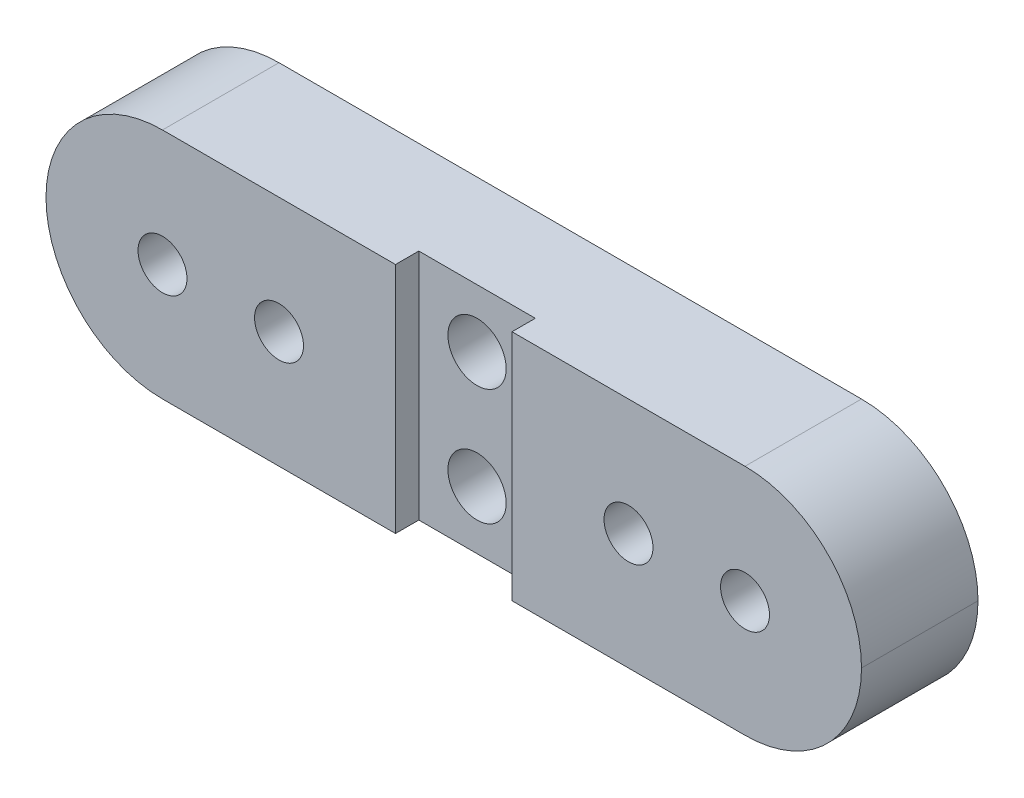
ISO-10303-21;
HEADER;
FILE_DESCRIPTION(('STEP AP214'),'2;1');
FILE_NAME('part.step','',(''),(''),'','','');
FILE_SCHEMA(('AUTOMOTIVE_DESIGN { 1 0 10303 214 1 1 1 1 }'));
ENDSEC;
DATA;
#1=APPLICATION_CONTEXT('core data for automotive mechanical design processes');
#2=APPLICATION_PROTOCOL_DEFINITION('international standard','automotive_design',2000,#1);
#3=PRODUCT_CONTEXT('',#1,'mechanical');
#4=PRODUCT('Part','Part','',(#3));
#5=PRODUCT_RELATED_PRODUCT_CATEGORY('part','',(#4));
#6=PRODUCT_DEFINITION_FORMATION('','',#4);
#7=PRODUCT_DEFINITION_CONTEXT('part definition',#1,'design');
#8=PRODUCT_DEFINITION('design','',#6,#7);
#9=PRODUCT_DEFINITION_SHAPE('','',#8);
#10=(LENGTH_UNIT() NAMED_UNIT(*) SI_UNIT(.MILLI.,.METRE.));
#11=(NAMED_UNIT(*) PLANE_ANGLE_UNIT() SI_UNIT($,.RADIAN.));
#12=(NAMED_UNIT(*) SI_UNIT($,.STERADIAN.) SOLID_ANGLE_UNIT());
#13=UNCERTAINTY_MEASURE_WITH_UNIT(LENGTH_MEASURE(1.E-05),#10,'distance_accuracy_value','');
#14=(GEOMETRIC_REPRESENTATION_CONTEXT(3) GLOBAL_UNCERTAINTY_ASSIGNED_CONTEXT((#13)) GLOBAL_UNIT_ASSIGNED_CONTEXT((#10,
#11,#12)) REPRESENTATION_CONTEXT('',''));
#15=CARTESIAN_POINT('',(0.,0.,0.));
#16=DIRECTION('',(0.,0.,1.));
#17=DIRECTION('',(1.,0.,0.));
#18=AXIS2_PLACEMENT_3D('',#15,#16,#17);
#19=CARTESIAN_POINT('',(0.,0.,10.));
#20=DIRECTION('',(0.,0.,1.));
#21=DIRECTION('',(1.,0.,0.));
#22=AXIS2_PLACEMENT_3D('',#19,#20,#21);
#23=PLANE('',#22);
#24=DIRECTION('',(0.,1.,0.));
#25=VECTOR('',#24,1.);
#26=CARTESIAN_POINT('',(40.,20.,10.));
#27=LINE('',#26,#25);
#28=CARTESIAN_POINT('',(40.,0.,10.));
#29=VERTEX_POINT('',#28);
#30=CARTESIAN_POINT('',(40.,20.,10.));
#31=VERTEX_POINT('',#30);
#32=EDGE_CURVE('E135',#29,#31,#27,.T.);
#33=ORIENTED_EDGE('',*,*,#32,.F.);
#34=DIRECTION('',(1.,0.,0.));
#35=VECTOR('',#34,1.);
#36=CARTESIAN_POINT('',(0.,0.,10.));
#37=LINE('',#36,#35);
#38=CARTESIAN_POINT('',(60.,0.,10.));
#39=VERTEX_POINT('',#38);
#40=EDGE_CURVE('E175',#29,#39,#37,.T.);
#41=ORIENTED_EDGE('',*,*,#40,.T.);
#42=CARTESIAN_POINT('',(60.,10.,10.));
#43=DIRECTION('',(0.,0.,1.));
#44=DIRECTION('',(1.,0.,0.));
#45=AXIS2_PLACEMENT_3D('',#42,#43,#44);
#46=CIRCLE('',#45,10.);
#47=CARTESIAN_POINT('',(70.,10.,10.));
#48=VERTEX_POINT('',#47);
#49=EDGE_CURVE('E208',#39,#48,#46,.T.);
#50=ORIENTED_EDGE('',*,*,#49,.T.);
#51=CARTESIAN_POINT('',(60.,10.,10.));
#52=DIRECTION('',(0.,0.,1.));
#53=DIRECTION('',(1.,0.,0.));
#54=AXIS2_PLACEMENT_3D('',#51,#52,#53);
#55=CIRCLE('',#54,10.);
#56=CARTESIAN_POINT('',(60.,20.,10.));
#57=VERTEX_POINT('',#56);
#58=EDGE_CURVE('E206',#48,#57,#55,.T.);
#59=ORIENTED_EDGE('',*,*,#58,.T.);
#60=DIRECTION('',(-1.,0.,0.));
#61=VECTOR('',#60,1.);
#62=CARTESIAN_POINT('',(0.,20.,10.));
#63=LINE('',#62,#61);
#64=EDGE_CURVE('E176',#57,#31,#63,.T.);
#65=ORIENTED_EDGE('',*,*,#64,.T.);
#66=EDGE_LOOP('',(#33,#41,#50,#59,#65));
#67=FACE_BOUND('',#66,.T.);
#68=CARTESIAN_POINT('',(60.,10.,10.));
#69=DIRECTION('',(0.,0.,1.));
#70=DIRECTION('',(1.,0.,0.));
#71=AXIS2_PLACEMENT_3D('',#68,#69,#70);
#72=CIRCLE('',#71,2.09999999999998);
#73=CARTESIAN_POINT('',(62.1,10.,10.));
#74=VERTEX_POINT('',#73);
#75=EDGE_CURVE('E153',#74,#74,#72,.T.);
#76=ORIENTED_EDGE('',*,*,#75,.F.);
#77=EDGE_LOOP('',(#76));
#78=FACE_BOUND('',#77,.T.);
#79=CARTESIAN_POINT('',(50.,10.,10.));
#80=DIRECTION('',(0.,0.,1.));
#81=DIRECTION('',(1.,0.,0.));
#82=AXIS2_PLACEMENT_3D('',#79,#80,#81);
#83=CIRCLE('',#82,2.09999999999999);
#84=CARTESIAN_POINT('',(52.1,10.,10.));
#85=VERTEX_POINT('',#84);
#86=EDGE_CURVE('E147',#85,#85,#83,.T.);
#87=ORIENTED_EDGE('',*,*,#86,.F.);
#88=EDGE_LOOP('',(#87));
#89=FACE_BOUND('',#88,.T.);
#90=ADVANCED_FACE('F41',(#67,#78,#89),#23,.T.);
#91=CARTESIAN_POINT('',(0.,0.,10.));
#92=DIRECTION('',(0.,1.,0.));
#93=DIRECTION('',(-1.,0.,0.));
#94=AXIS2_PLACEMENT_3D('',#91,#92,#93);
#95=PLANE('',#94);
#96=ORIENTED_EDGE('',*,*,#40,.F.);
#97=DIRECTION('',(0.,0.,1.));
#98=VECTOR('',#97,1.);
#99=CARTESIAN_POINT('',(40.,0.,8.));
#100=LINE('',#99,#98);
#101=CARTESIAN_POINT('',(40.,0.,8.));
#102=VERTEX_POINT('',#101);
#103=EDGE_CURVE('E139',#102,#29,#100,.T.);
#104=ORIENTED_EDGE('',*,*,#103,.F.);
#105=DIRECTION('',(1.,0.,0.));
#106=VECTOR('',#105,1.);
#107=CARTESIAN_POINT('',(40.,0.,8.));
#108=LINE('',#107,#106);
#109=CARTESIAN_POINT('',(30.,0.,8.));
#110=VERTEX_POINT('',#109);
#111=EDGE_CURVE('E124',#110,#102,#108,.T.);
#112=ORIENTED_EDGE('',*,*,#111,.F.);
#113=DIRECTION('',(0.,0.,1.));
#114=VECTOR('',#113,1.);
#115=CARTESIAN_POINT('',(30.,0.,8.));
#116=LINE('',#115,#114);
#117=CARTESIAN_POINT('',(30.,0.,10.));
#118=VERTEX_POINT('',#117);
#119=EDGE_CURVE('E121',#110,#118,#116,.T.);
#120=ORIENTED_EDGE('',*,*,#119,.T.);
#121=CARTESIAN_POINT('',(10.,0.,10.));
#122=VERTEX_POINT('',#121);
#123=EDGE_CURVE('E172',#122,#118,#37,.T.);
#124=ORIENTED_EDGE('',*,*,#123,.F.);
#125=DIRECTION('',(0.,0.,-1.));
#126=VECTOR('',#125,1.);
#127=CARTESIAN_POINT('',(10.,0.,10.));
#128=LINE('',#127,#126);
#129=CARTESIAN_POINT('',(10.,0.,0.));
#130=VERTEX_POINT('',#129);
#131=EDGE_CURVE('E195',#122,#130,#128,.T.);
#132=ORIENTED_EDGE('',*,*,#131,.T.);
#133=DIRECTION('',(1.,0.,0.));
#134=VECTOR('',#133,1.);
#135=CARTESIAN_POINT('',(0.,0.,0.));
#136=LINE('',#135,#134);
#137=CARTESIAN_POINT('',(60.,0.,0.));
#138=VERTEX_POINT('',#137);
#139=EDGE_CURVE('E180',#130,#138,#136,.T.);
#140=ORIENTED_EDGE('',*,*,#139,.T.);
#141=DIRECTION('',(0.,0.,-1.));
#142=VECTOR('',#141,1.);
#143=CARTESIAN_POINT('',(60.,0.,10.));
#144=LINE('',#143,#142);
#145=EDGE_CURVE('E179',#138,#39,#144,.F.);
#146=ORIENTED_EDGE('',*,*,#145,.T.);
#147=EDGE_LOOP('',(#96,#104,#112,#120,#124,#132,#140,#146));
#148=FACE_BOUND('',#147,.T.);
#149=ADVANCED_FACE('F244',(#148),#95,.F.);
#150=CARTESIAN_POINT('',(35.,15.,10.));
#151=DIRECTION('',(0.,0.,-1.));
#152=DIRECTION('',(-1.,0.,0.));
#153=AXIS2_PLACEMENT_3D('',#150,#151,#152);
#154=CYLINDRICAL_SURFACE('',#153,2.49999999999999);
#155=CARTESIAN_POINT('',(35.,15.,8.));
#156=DIRECTION('',(0.,0.,-1.));
#157=DIRECTION('',(-1.,0.,0.));
#158=AXIS2_PLACEMENT_3D('',#155,#156,#157);
#159=CIRCLE('',#158,2.49999999999999);
#160=CARTESIAN_POINT('',(32.5,15.,8.));
#161=VERTEX_POINT('',#160);
#162=EDGE_CURVE('E144',#161,#161,#159,.T.);
#163=ORIENTED_EDGE('',*,*,#162,.F.);
#164=EDGE_LOOP('',(#163));
#165=FACE_BOUND('',#164,.T.);
#166=CARTESIAN_POINT('',(35.,15.,0.));
#167=DIRECTION('',(0.,0.,1.));
#168=DIRECTION('',(1.,0.,0.));
#169=AXIS2_PLACEMENT_3D('',#166,#167,#168);
#170=CIRCLE('',#169,2.49999999999999);
#171=CARTESIAN_POINT('',(37.5,15.,0.));
#172=VERTEX_POINT('',#171);
#173=EDGE_CURVE('E187',#172,#172,#170,.T.);
#174=ORIENTED_EDGE('',*,*,#173,.F.);
#175=EDGE_LOOP('',(#174));
#176=FACE_BOUND('',#175,.T.);
#177=ADVANCED_FACE('F275',(#165,#176),#154,.F.);
#178=CARTESIAN_POINT('',(0.,20.,10.));
#179=DIRECTION('',(0.,-1.,0.));
#180=DIRECTION('',(1.,0.,0.));
#181=AXIS2_PLACEMENT_3D('',#178,#179,#180);
#182=PLANE('',#181);
#183=DIRECTION('',(-1.,0.,0.));
#184=VECTOR('',#183,1.);
#185=CARTESIAN_POINT('',(30.,20.,8.));
#186=LINE('',#185,#184);
#187=CARTESIAN_POINT('',(40.,20.,8.));
#188=VERTEX_POINT('',#187);
#189=CARTESIAN_POINT('',(30.,20.,8.));
#190=VERTEX_POINT('',#189);
#191=EDGE_CURVE('E125',#188,#190,#186,.T.);
#192=ORIENTED_EDGE('',*,*,#191,.F.);
#193=DIRECTION('',(0.,0.,1.));
#194=VECTOR('',#193,1.);
#195=CARTESIAN_POINT('',(40.,20.,8.));
#196=LINE('',#195,#194);
#197=EDGE_CURVE('E232',#188,#31,#196,.T.);
#198=ORIENTED_EDGE('',*,*,#197,.T.);
#199=ORIENTED_EDGE('',*,*,#64,.F.);
#200=DIRECTION('',(0.,0.,-1.));
#201=VECTOR('',#200,1.);
#202=CARTESIAN_POINT('',(60.,20.,0.));
#203=LINE('',#202,#201);
#204=CARTESIAN_POINT('',(60.,20.,0.));
#205=VERTEX_POINT('',#204);
#206=EDGE_CURVE('E50',#57,#205,#203,.T.);
#207=ORIENTED_EDGE('',*,*,#206,.T.);
#208=DIRECTION('',(-1.,0.,0.));
#209=VECTOR('',#208,1.);
#210=CARTESIAN_POINT('',(0.,20.,0.));
#211=LINE('',#210,#209);
#212=CARTESIAN_POINT('',(10.,20.,0.));
#213=VERTEX_POINT('',#212);
#214=EDGE_CURVE('E183',#205,#213,#211,.T.);
#215=ORIENTED_EDGE('',*,*,#214,.T.);
#216=DIRECTION('',(0.,0.,-1.));
#217=VECTOR('',#216,1.);
#218=CARTESIAN_POINT('',(10.,20.,10.));
#219=LINE('',#218,#217);
#220=CARTESIAN_POINT('',(10.,20.,10.));
#221=VERTEX_POINT('',#220);
#222=EDGE_CURVE('E11',#213,#221,#219,.F.);
#223=ORIENTED_EDGE('',*,*,#222,.T.);
#224=CARTESIAN_POINT('',(30.,20.,10.));
#225=VERTEX_POINT('',#224);
#226=EDGE_CURVE('E65',#225,#221,#63,.T.);
#227=ORIENTED_EDGE('',*,*,#226,.F.);
#228=DIRECTION('',(0.,0.,1.));
#229=VECTOR('',#228,1.);
#230=CARTESIAN_POINT('',(30.,20.,8.));
#231=LINE('',#230,#229);
#232=EDGE_CURVE('E58',#190,#225,#231,.T.);
#233=ORIENTED_EDGE('',*,*,#232,.F.);
#234=EDGE_LOOP('',(#192,#198,#199,#207,#215,#223,#227,#233));
#235=FACE_BOUND('',#234,.T.);
#236=ADVANCED_FACE('F137',(#235),#182,.F.);
#237=CARTESIAN_POINT('',(35.,5.,10.));
#238=DIRECTION('',(0.,0.,-1.));
#239=DIRECTION('',(-1.,0.,0.));
#240=AXIS2_PLACEMENT_3D('',#237,#238,#239);
#241=CYLINDRICAL_SURFACE('',#240,2.49999999999999);
#242=CARTESIAN_POINT('',(35.,5.,8.));
#243=DIRECTION('',(0.,0.,-1.));
#244=DIRECTION('',(-1.,0.,0.));
#245=AXIS2_PLACEMENT_3D('',#242,#243,#244);
#246=CIRCLE('',#245,2.49999999999999);
#247=CARTESIAN_POINT('',(32.5,5.,8.));
#248=VERTEX_POINT('',#247);
#249=EDGE_CURVE('E45',#248,#248,#246,.F.);
#250=ORIENTED_EDGE('',*,*,#249,.T.);
#251=EDGE_LOOP('',(#250));
#252=FACE_BOUND('',#251,.T.);
#253=CARTESIAN_POINT('',(35.,5.,0.));
#254=DIRECTION('',(0.,0.,1.));
#255=DIRECTION('',(1.,0.,0.));
#256=AXIS2_PLACEMENT_3D('',#253,#254,#255);
#257=CIRCLE('',#256,2.49999999999999);
#258=CARTESIAN_POINT('',(37.5,5.,0.));
#259=VERTEX_POINT('',#258);
#260=EDGE_CURVE('E190',#259,#259,#257,.F.);
#261=ORIENTED_EDGE('',*,*,#260,.T.);
#262=EDGE_LOOP('',(#261));
#263=FACE_BOUND('',#262,.T.);
#264=ADVANCED_FACE('F279',(#252,#263),#241,.F.);
#265=DIRECTION('',(0.,-1.,0.));
#266=VECTOR('',#265,1.);
#267=CARTESIAN_POINT('',(30.,0.,10.));
#268=LINE('',#267,#266);
#269=EDGE_CURVE('E238',#225,#118,#268,.T.);
#270=ORIENTED_EDGE('',*,*,#269,.F.);
#271=ORIENTED_EDGE('',*,*,#226,.T.);
#272=CARTESIAN_POINT('',(10.,10.,10.));
#273=DIRECTION('',(0.,0.,1.));
#274=DIRECTION('',(1.,0.,0.));
#275=AXIS2_PLACEMENT_3D('',#272,#273,#274);
#276=CIRCLE('',#275,10.);
#277=CARTESIAN_POINT('',(0.,10.,10.));
#278=VERTEX_POINT('',#277);
#279=EDGE_CURVE('E210',#221,#278,#276,.T.);
#280=ORIENTED_EDGE('',*,*,#279,.T.);
#281=CARTESIAN_POINT('',(10.,10.,10.));
#282=DIRECTION('',(0.,0.,1.));
#283=DIRECTION('',(1.,0.,0.));
#284=AXIS2_PLACEMENT_3D('',#281,#282,#283);
#285=CIRCLE('',#284,10.);
#286=EDGE_CURVE('E212',#278,#122,#285,.T.);
#287=ORIENTED_EDGE('',*,*,#286,.T.);
#288=ORIENTED_EDGE('',*,*,#123,.T.);
#289=EDGE_LOOP('',(#270,#271,#280,#287,#288));
#290=FACE_BOUND('',#289,.T.);
#291=CARTESIAN_POINT('',(10.,10.,10.));
#292=DIRECTION('',(0.,0.,1.));
#293=DIRECTION('',(1.,0.,0.));
#294=AXIS2_PLACEMENT_3D('',#291,#292,#293);
#295=CIRCLE('',#294,2.09999999999999);
#296=CARTESIAN_POINT('',(12.1,10.,10.));
#297=VERTEX_POINT('',#296);
#298=EDGE_CURVE('E159',#297,#297,#295,.T.);
#299=ORIENTED_EDGE('',*,*,#298,.F.);
#300=EDGE_LOOP('',(#299));
#301=FACE_BOUND('',#300,.T.);
#302=CARTESIAN_POINT('',(20.,10.,10.));
#303=DIRECTION('',(0.,0.,1.));
#304=DIRECTION('',(1.,0.,0.));
#305=AXIS2_PLACEMENT_3D('',#302,#303,#304);
#306=CIRCLE('',#305,2.09999999999999);
#307=CARTESIAN_POINT('',(22.1,10.,10.));
#308=VERTEX_POINT('',#307);
#309=EDGE_CURVE('E165',#308,#308,#306,.T.);
#310=ORIENTED_EDGE('',*,*,#309,.F.);
#311=EDGE_LOOP('',(#310));
#312=FACE_BOUND('',#311,.T.);
#313=ADVANCED_FACE('F258',(#290,#301,#312),#23,.T.);
#314=CARTESIAN_POINT('',(0.,0.,0.));
#315=DIRECTION('',(0.,0.,1.));
#316=DIRECTION('',(1.,0.,0.));
#317=AXIS2_PLACEMENT_3D('',#314,#315,#316);
#318=PLANE('',#317);
#319=CARTESIAN_POINT('',(50.,10.,0.));
#320=DIRECTION('',(0.,0.,1.));
#321=DIRECTION('',(1.,0.,0.));
#322=AXIS2_PLACEMENT_3D('',#319,#320,#321);
#323=CIRCLE('',#322,2.1);
#324=CARTESIAN_POINT('',(52.1,10.,0.));
#325=VERTEX_POINT('',#324);
#326=EDGE_CURVE('E150',#325,#325,#323,.T.);
#327=ORIENTED_EDGE('',*,*,#326,.T.);
#328=EDGE_LOOP('',(#327));
#329=FACE_BOUND('',#328,.T.);
#330=CARTESIAN_POINT('',(60.,10.,0.));
#331=DIRECTION('',(0.,0.,1.));
#332=DIRECTION('',(1.,0.,0.));
#333=AXIS2_PLACEMENT_3D('',#330,#331,#332);
#334=CIRCLE('',#333,2.1);
#335=CARTESIAN_POINT('',(62.1,10.,0.));
#336=VERTEX_POINT('',#335);
#337=EDGE_CURVE('E156',#336,#336,#334,.T.);
#338=ORIENTED_EDGE('',*,*,#337,.T.);
#339=EDGE_LOOP('',(#338));
#340=FACE_BOUND('',#339,.T.);
#341=CARTESIAN_POINT('',(10.,10.,0.));
#342=DIRECTION('',(0.,0.,1.));
#343=DIRECTION('',(1.,0.,0.));
#344=AXIS2_PLACEMENT_3D('',#341,#342,#343);
#345=CIRCLE('',#344,2.1);
#346=CARTESIAN_POINT('',(12.1,10.,0.));
#347=VERTEX_POINT('',#346);
#348=EDGE_CURVE('E162',#347,#347,#345,.T.);
#349=ORIENTED_EDGE('',*,*,#348,.T.);
#350=EDGE_LOOP('',(#349));
#351=FACE_BOUND('',#350,.T.);
#352=CARTESIAN_POINT('',(20.,10.,0.));
#353=DIRECTION('',(0.,0.,1.));
#354=DIRECTION('',(1.,0.,0.));
#355=AXIS2_PLACEMENT_3D('',#352,#353,#354);
#356=CIRCLE('',#355,2.1);
#357=CARTESIAN_POINT('',(22.1,10.,0.));
#358=VERTEX_POINT('',#357);
#359=EDGE_CURVE('E168',#358,#358,#356,.T.);
#360=ORIENTED_EDGE('',*,*,#359,.T.);
#361=EDGE_LOOP('',(#360));
#362=FACE_BOUND('',#361,.T.);
#363=ORIENTED_EDGE('',*,*,#139,.F.);
#364=CARTESIAN_POINT('',(10.,10.,0.));
#365=DIRECTION('',(0.,0.,1.));
#366=DIRECTION('',(1.,0.,0.));
#367=AXIS2_PLACEMENT_3D('',#364,#365,#366);
#368=CIRCLE('',#367,10.);
#369=CARTESIAN_POINT('',(0.,10.,0.));
#370=VERTEX_POINT('',#369);
#371=EDGE_CURVE('E204',#130,#370,#368,.F.);
#372=ORIENTED_EDGE('',*,*,#371,.T.);
#373=CARTESIAN_POINT('',(10.,10.,0.));
#374=DIRECTION('',(0.,0.,1.));
#375=DIRECTION('',(1.,0.,0.));
#376=AXIS2_PLACEMENT_3D('',#373,#374,#375);
#377=CIRCLE('',#376,10.);
#378=EDGE_CURVE('E202',#370,#213,#377,.F.);
#379=ORIENTED_EDGE('',*,*,#378,.T.);
#380=ORIENTED_EDGE('',*,*,#214,.F.);
#381=CARTESIAN_POINT('',(60.,10.,0.));
#382=DIRECTION('',(0.,0.,1.));
#383=DIRECTION('',(1.,0.,0.));
#384=AXIS2_PLACEMENT_3D('',#381,#382,#383);
#385=CIRCLE('',#384,10.);
#386=CARTESIAN_POINT('',(70.,10.,0.));
#387=VERTEX_POINT('',#386);
#388=EDGE_CURVE('E198',#205,#387,#385,.F.);
#389=ORIENTED_EDGE('',*,*,#388,.T.);
#390=CARTESIAN_POINT('',(60.,10.,0.));
#391=DIRECTION('',(0.,0.,1.));
#392=DIRECTION('',(1.,0.,0.));
#393=AXIS2_PLACEMENT_3D('',#390,#391,#392);
#394=CIRCLE('',#393,10.);
#395=EDGE_CURVE('E200',#387,#138,#394,.F.);
#396=ORIENTED_EDGE('',*,*,#395,.T.);
#397=EDGE_LOOP('',(#363,#372,#379,#380,#389,#396));
#398=FACE_BOUND('',#397,.T.);
#399=ORIENTED_EDGE('',*,*,#173,.T.);
#400=EDGE_LOOP('',(#399));
#401=FACE_BOUND('',#400,.T.);
#402=ORIENTED_EDGE('',*,*,#260,.F.);
#403=EDGE_LOOP('',(#402));
#404=FACE_BOUND('',#403,.T.);
#405=ADVANCED_FACE('F249',(#329,#340,#351,#362,#398,#401,#404),#318,.F.);
#406=CARTESIAN_POINT('',(10.,10.,10.));
#407=DIRECTION('',(0.,0.,-1.));
#408=DIRECTION('',(-1.,0.,0.));
#409=AXIS2_PLACEMENT_3D('',#406,#407,#408);
#410=CYLINDRICAL_SURFACE('',#409,10.);
#411=DIRECTION('',(0.,0.,-1.));
#412=VECTOR('',#411,1.);
#413=CARTESIAN_POINT('',(0.,10.,10.));
#414=LINE('',#413,#412);
#415=EDGE_CURVE('E184',#278,#370,#414,.T.);
#416=ORIENTED_EDGE('',*,*,#415,.F.);
#417=ORIENTED_EDGE('',*,*,#279,.F.);
#418=ORIENTED_EDGE('',*,*,#222,.F.);
#419=ORIENTED_EDGE('',*,*,#378,.F.);
#420=EDGE_LOOP('',(#416,#417,#418,#419));
#421=FACE_BOUND('',#420,.T.);
#422=ADVANCED_FACE('F256',(#421),#410,.T.);
#423=CARTESIAN_POINT('',(10.,10.,10.));
#424=DIRECTION('',(0.,0.,-1.));
#425=DIRECTION('',(-1.,0.,0.));
#426=AXIS2_PLACEMENT_3D('',#423,#424,#425);
#427=CYLINDRICAL_SURFACE('',#426,10.);
#428=ORIENTED_EDGE('',*,*,#286,.F.);
#429=ORIENTED_EDGE('',*,*,#415,.T.);
#430=ORIENTED_EDGE('',*,*,#371,.F.);
#431=ORIENTED_EDGE('',*,*,#131,.F.);
#432=EDGE_LOOP('',(#428,#429,#430,#431));
#433=FACE_BOUND('',#432,.T.);
#434=ADVANCED_FACE('F261',(#433),#427,.T.);
#435=CARTESIAN_POINT('',(60.,10.,10.));
#436=DIRECTION('',(0.,0.,1.));
#437=DIRECTION('',(1.,0.,0.));
#438=AXIS2_PLACEMENT_3D('',#435,#436,#437);
#439=CYLINDRICAL_SURFACE('',#438,10.);
#440=ORIENTED_EDGE('',*,*,#206,.F.);
#441=ORIENTED_EDGE('',*,*,#58,.F.);
#442=DIRECTION('',(0.,0.,-1.));
#443=VECTOR('',#442,1.);
#444=CARTESIAN_POINT('',(70.,10.,10.));
#445=LINE('',#444,#443);
#446=EDGE_CURVE('E171',#387,#48,#445,.F.);
#447=ORIENTED_EDGE('',*,*,#446,.F.);
#448=ORIENTED_EDGE('',*,*,#388,.F.);
#449=EDGE_LOOP('',(#440,#441,#447,#448));
#450=FACE_BOUND('',#449,.T.);
#451=ADVANCED_FACE('F43',(#450),#439,.T.);
#452=CARTESIAN_POINT('',(60.,10.,10.));
#453=DIRECTION('',(0.,0.,1.));
#454=DIRECTION('',(1.,0.,0.));
#455=AXIS2_PLACEMENT_3D('',#452,#453,#454);
#456=CYLINDRICAL_SURFACE('',#455,10.);
#457=ORIENTED_EDGE('',*,*,#49,.F.);
#458=ORIENTED_EDGE('',*,*,#145,.F.);
#459=ORIENTED_EDGE('',*,*,#395,.F.);
#460=ORIENTED_EDGE('',*,*,#446,.T.);
#461=EDGE_LOOP('',(#457,#458,#459,#460));
#462=FACE_BOUND('',#461,.T.);
#463=ADVANCED_FACE('F221',(#462),#456,.T.);
#464=CARTESIAN_POINT('',(20.,10.,10.));
#465=DIRECTION('',(0.,0.,1.));
#466=DIRECTION('',(1.,0.,0.));
#467=AXIS2_PLACEMENT_3D('',#464,#465,#466);
#468=CYLINDRICAL_SURFACE('',#467,2.09999999999999);
#469=ORIENTED_EDGE('',*,*,#359,.F.);
#470=EDGE_LOOP('',(#469));
#471=FACE_BOUND('',#470,.T.);
#472=ORIENTED_EDGE('',*,*,#309,.T.);
#473=EDGE_LOOP('',(#472));
#474=FACE_BOUND('',#473,.T.);
#475=ADVANCED_FACE('F322',(#471,#474),#468,.F.);
#476=CARTESIAN_POINT('',(10.,10.,10.));
#477=DIRECTION('',(0.,0.,1.));
#478=DIRECTION('',(1.,0.,0.));
#479=AXIS2_PLACEMENT_3D('',#476,#477,#478);
#480=CYLINDRICAL_SURFACE('',#479,2.09999999999999);
#481=ORIENTED_EDGE('',*,*,#348,.F.);
#482=EDGE_LOOP('',(#481));
#483=FACE_BOUND('',#482,.T.);
#484=ORIENTED_EDGE('',*,*,#298,.T.);
#485=EDGE_LOOP('',(#484));
#486=FACE_BOUND('',#485,.T.);
#487=ADVANCED_FACE('F319',(#483,#486),#480,.F.);
#488=CARTESIAN_POINT('',(60.,10.,10.));
#489=DIRECTION('',(0.,0.,1.));
#490=DIRECTION('',(1.,0.,0.));
#491=AXIS2_PLACEMENT_3D('',#488,#489,#490);
#492=CYLINDRICAL_SURFACE('',#491,2.09999999999999);
#493=ORIENTED_EDGE('',*,*,#337,.F.);
#494=EDGE_LOOP('',(#493));
#495=FACE_BOUND('',#494,.T.);
#496=ORIENTED_EDGE('',*,*,#75,.T.);
#497=EDGE_LOOP('',(#496));
#498=FACE_BOUND('',#497,.T.);
#499=ADVANCED_FACE('F311',(#495,#498),#492,.F.);
#500=CARTESIAN_POINT('',(50.,10.,10.));
#501=DIRECTION('',(0.,0.,1.));
#502=DIRECTION('',(1.,0.,0.));
#503=AXIS2_PLACEMENT_3D('',#500,#501,#502);
#504=CYLINDRICAL_SURFACE('',#503,2.09999999999999);
#505=ORIENTED_EDGE('',*,*,#326,.F.);
#506=EDGE_LOOP('',(#505));
#507=FACE_BOUND('',#506,.T.);
#508=ORIENTED_EDGE('',*,*,#86,.T.);
#509=EDGE_LOOP('',(#508));
#510=FACE_BOUND('',#509,.T.);
#511=ADVANCED_FACE('F304',(#507,#510),#504,.F.);
#512=CARTESIAN_POINT('',(0.,0.,8.));
#513=DIRECTION('',(0.,0.,-1.));
#514=DIRECTION('',(-1.,0.,0.));
#515=AXIS2_PLACEMENT_3D('',#512,#513,#514);
#516=PLANE('',#515);
#517=ORIENTED_EDGE('',*,*,#162,.T.);
#518=EDGE_LOOP('',(#517));
#519=FACE_BOUND('',#518,.T.);
#520=ORIENTED_EDGE('',*,*,#191,.T.);
#521=DIRECTION('',(0.,-1.,0.));
#522=VECTOR('',#521,1.);
#523=CARTESIAN_POINT('',(30.,0.,8.));
#524=LINE('',#523,#522);
#525=EDGE_CURVE('E117',#190,#110,#524,.T.);
#526=ORIENTED_EDGE('',*,*,#525,.T.);
#527=ORIENTED_EDGE('',*,*,#111,.T.);
#528=DIRECTION('',(0.,1.,0.));
#529=VECTOR('',#528,1.);
#530=CARTESIAN_POINT('',(40.,20.,8.));
#531=LINE('',#530,#529);
#532=EDGE_CURVE('E132',#102,#188,#531,.T.);
#533=ORIENTED_EDGE('',*,*,#532,.T.);
#534=EDGE_LOOP('',(#520,#526,#527,#533));
#535=FACE_BOUND('',#534,.T.);
#536=ORIENTED_EDGE('',*,*,#249,.F.);
#537=EDGE_LOOP('',(#536));
#538=FACE_BOUND('',#537,.T.);
#539=ADVANCED_FACE('F129',(#519,#535,#538),#516,.F.);
#540=CARTESIAN_POINT('',(40.,20.,8.));
#541=DIRECTION('',(1.,0.,0.));
#542=DIRECTION('',(0.,0.,-1.));
#543=AXIS2_PLACEMENT_3D('',#540,#541,#542);
#544=PLANE('',#543);
#545=ORIENTED_EDGE('',*,*,#32,.T.);
#546=ORIENTED_EDGE('',*,*,#197,.F.);
#547=ORIENTED_EDGE('',*,*,#532,.F.);
#548=ORIENTED_EDGE('',*,*,#103,.T.);
#549=EDGE_LOOP('',(#545,#546,#547,#548));
#550=FACE_BOUND('',#549,.T.);
#551=ADVANCED_FACE('F242',(#550),#544,.F.);
#552=CARTESIAN_POINT('',(30.,0.,8.));
#553=DIRECTION('',(-1.,0.,0.));
#554=DIRECTION('',(0.,0.,1.));
#555=AXIS2_PLACEMENT_3D('',#552,#553,#554);
#556=PLANE('',#555);
#557=ORIENTED_EDGE('',*,*,#269,.T.);
#558=ORIENTED_EDGE('',*,*,#119,.F.);
#559=ORIENTED_EDGE('',*,*,#525,.F.);
#560=ORIENTED_EDGE('',*,*,#232,.T.);
#561=EDGE_LOOP('',(#557,#558,#559,#560));
#562=FACE_BOUND('',#561,.T.);
#563=ADVANCED_FACE('F119',(#562),#556,.F.);
#564=CLOSED_SHELL('',(#90,#149,#177,#236,#264,#313,#405,#422,#434,#451,#463,#475,#487,#499,#511,
#539,#551,#563));
#565=MANIFOLD_SOLID_BREP('B2',#564);
#566=ADVANCED_BREP_SHAPE_REPRESENTATION('',(#18,#565),#14);
#567=SHAPE_DEFINITION_REPRESENTATION(#9,#566);
ENDSEC;
END-ISO-10303-21;
